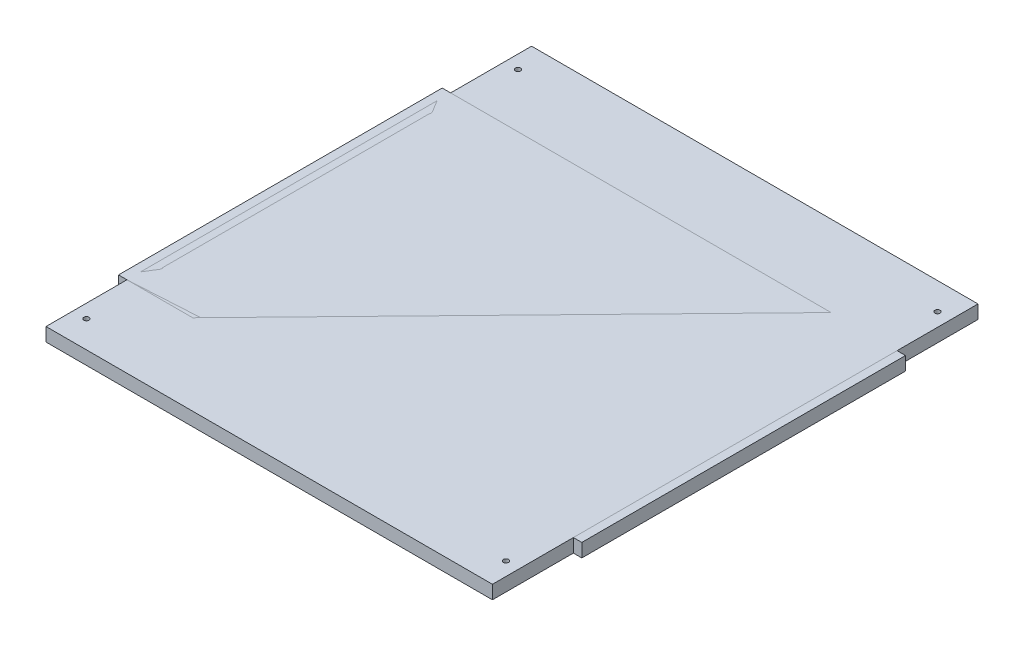
ISO-10303-21;
HEADER;
FILE_DESCRIPTION(('STEP AP214'),'2;1');
FILE_NAME('part.step','',(''),(''),'','','');
FILE_SCHEMA(('AUTOMOTIVE_DESIGN { 1 0 10303 214 1 1 1 1 }'));
ENDSEC;
DATA;
#1=APPLICATION_CONTEXT('core data for automotive mechanical design processes');
#2=APPLICATION_PROTOCOL_DEFINITION('international standard','automotive_design',2000,#1);
#3=PRODUCT_CONTEXT('',#1,'mechanical');
#4=PRODUCT('Part','Part','',(#3));
#5=PRODUCT_RELATED_PRODUCT_CATEGORY('part','',(#4));
#6=PRODUCT_DEFINITION_FORMATION('','',#4);
#7=PRODUCT_DEFINITION_CONTEXT('part definition',#1,'design');
#8=PRODUCT_DEFINITION('design','',#6,#7);
#9=PRODUCT_DEFINITION_SHAPE('','',#8);
#10=(LENGTH_UNIT() NAMED_UNIT(*) SI_UNIT(.MILLI.,.METRE.));
#11=(NAMED_UNIT(*) PLANE_ANGLE_UNIT() SI_UNIT($,.RADIAN.));
#12=(NAMED_UNIT(*) SI_UNIT($,.STERADIAN.) SOLID_ANGLE_UNIT());
#13=UNCERTAINTY_MEASURE_WITH_UNIT(LENGTH_MEASURE(1.E-05),#10,'distance_accuracy_value','');
#14=(GEOMETRIC_REPRESENTATION_CONTEXT(3) GLOBAL_UNCERTAINTY_ASSIGNED_CONTEXT((#13)) GLOBAL_UNIT_ASSIGNED_CONTEXT((#10,
#11,#12)) REPRESENTATION_CONTEXT('',''));
#15=CARTESIAN_POINT('',(0.,0.,0.));
#16=DIRECTION('',(0.,0.,1.));
#17=DIRECTION('',(1.,0.,0.));
#18=AXIS2_PLACEMENT_3D('',#15,#16,#17);
#19=CARTESIAN_POINT('',(210.185,12.7,228.6));
#20=DIRECTION('',(-1.,0.,0.));
#21=DIRECTION('',(0.,0.,1.));
#22=AXIS2_PLACEMENT_3D('',#19,#20,#21);
#23=PLANE('',#22);
#24=DIRECTION('',(0.,0.,-1.));
#25=VECTOR('',#24,1.);
#26=CARTESIAN_POINT('',(210.185,0.,228.6));
#27=LINE('',#26,#25);
#28=CARTESIAN_POINT('',(210.185,0.,228.6));
#29=VERTEX_POINT('',#28);
#30=CARTESIAN_POINT('',(210.185,0.,-228.6));
#31=VERTEX_POINT('',#30);
#32=EDGE_CURVE('E106',#29,#31,#27,.T.);
#33=ORIENTED_EDGE('',*,*,#32,.T.);
#34=DIRECTION('',(0.,-1.,0.));
#35=VECTOR('',#34,1.);
#36=CARTESIAN_POINT('',(210.185,12.7,-228.6));
#37=LINE('',#36,#35);
#38=CARTESIAN_POINT('',(210.185,12.7,-228.6));
#39=VERTEX_POINT('',#38);
#40=EDGE_CURVE('E12',#39,#31,#37,.T.);
#41=ORIENTED_EDGE('',*,*,#40,.F.);
#42=DIRECTION('',(0.,0.,-1.));
#43=VECTOR('',#42,1.);
#44=CARTESIAN_POINT('',(210.185,12.7,228.6));
#45=LINE('',#44,#43);
#46=CARTESIAN_POINT('',(210.185,12.7,228.6));
#47=VERTEX_POINT('',#46);
#48=EDGE_CURVE('E94',#47,#39,#45,.T.);
#49=ORIENTED_EDGE('',*,*,#48,.F.);
#50=DIRECTION('',(0.,-1.,0.));
#51=VECTOR('',#50,1.);
#52=CARTESIAN_POINT('',(210.185,12.7,228.6));
#53=LINE('',#52,#51);
#54=EDGE_CURVE('E102',#47,#29,#53,.T.);
#55=ORIENTED_EDGE('',*,*,#54,.T.);
#56=EDGE_LOOP('',(#33,#41,#49,#55));
#57=FACE_BOUND('',#56,.T.);
#58=ADVANCED_FACE('F43',(#57),#23,.F.);
#59=CARTESIAN_POINT('',(-210.185,12.7,-228.6));
#60=DIRECTION('',(0.,0.,1.));
#61=DIRECTION('',(1.,0.,0.));
#62=AXIS2_PLACEMENT_3D('',#59,#60,#61);
#63=PLANE('',#62);
#64=DIRECTION('',(-1.,0.,0.));
#65=VECTOR('',#64,1.);
#66=CARTESIAN_POINT('',(-210.185,0.,-228.6));
#67=LINE('',#66,#65);
#68=CARTESIAN_POINT('',(-210.185,0.,-228.6));
#69=VERTEX_POINT('',#68);
#70=EDGE_CURVE('E98',#31,#69,#67,.T.);
#71=ORIENTED_EDGE('',*,*,#70,.T.);
#72=DIRECTION('',(0.,-1.,0.));
#73=VECTOR('',#72,1.);
#74=CARTESIAN_POINT('',(-210.185,12.7,-228.6));
#75=LINE('',#74,#73);
#76=CARTESIAN_POINT('',(-210.185,12.7,-228.6));
#77=VERTEX_POINT('',#76);
#78=EDGE_CURVE('E51',#77,#69,#75,.T.);
#79=ORIENTED_EDGE('',*,*,#78,.F.);
#80=DIRECTION('',(-1.,0.,0.));
#81=VECTOR('',#80,1.);
#82=CARTESIAN_POINT('',(-210.185,12.7,-228.6));
#83=LINE('',#82,#81);
#84=EDGE_CURVE('E89',#39,#77,#83,.T.);
#85=ORIENTED_EDGE('',*,*,#84,.F.);
#86=ORIENTED_EDGE('',*,*,#40,.T.);
#87=EDGE_LOOP('',(#71,#79,#85,#86));
#88=FACE_BOUND('',#87,.T.);
#89=ADVANCED_FACE('F97',(#88),#63,.F.);
#90=CARTESIAN_POINT('',(-210.185,12.7,228.6));
#91=DIRECTION('',(1.,0.,0.));
#92=DIRECTION('',(0.,0.,-1.));
#93=AXIS2_PLACEMENT_3D('',#90,#91,#92);
#94=PLANE('',#93);
#95=DIRECTION('',(0.,0.,1.));
#96=VECTOR('',#95,1.);
#97=CARTESIAN_POINT('',(-210.185,0.,228.6));
#98=LINE('',#97,#96);
#99=CARTESIAN_POINT('',(-210.185,0.,228.6));
#100=VERTEX_POINT('',#99);
#101=EDGE_CURVE('E76',#69,#100,#98,.T.);
#102=ORIENTED_EDGE('',*,*,#101,.T.);
#103=DIRECTION('',(0.,-1.,0.));
#104=VECTOR('',#103,1.);
#105=CARTESIAN_POINT('',(-210.185,12.7,228.6));
#106=LINE('',#105,#104);
#107=CARTESIAN_POINT('',(-210.185,12.7,228.6));
#108=VERTEX_POINT('',#107);
#109=EDGE_CURVE('E99',#108,#100,#106,.T.);
#110=ORIENTED_EDGE('',*,*,#109,.F.);
#111=DIRECTION('',(0.,0.,1.));
#112=VECTOR('',#111,1.);
#113=CARTESIAN_POINT('',(-210.185,12.7,228.6));
#114=LINE('',#113,#112);
#115=EDGE_CURVE('E92',#77,#108,#114,.T.);
#116=ORIENTED_EDGE('',*,*,#115,.F.);
#117=ORIENTED_EDGE('',*,*,#78,.T.);
#118=EDGE_LOOP('',(#102,#110,#116,#117));
#119=FACE_BOUND('',#118,.T.);
#120=ADVANCED_FACE('F100',(#119),#94,.F.);
#121=CARTESIAN_POINT('',(-210.185,12.7,228.6));
#122=DIRECTION('',(0.,0.,-1.));
#123=DIRECTION('',(-1.,0.,0.));
#124=AXIS2_PLACEMENT_3D('',#121,#122,#123);
#125=PLANE('',#124);
#126=DIRECTION('',(1.,0.,0.));
#127=VECTOR('',#126,1.);
#128=CARTESIAN_POINT('',(-210.185,0.,228.6));
#129=LINE('',#128,#127);
#130=EDGE_CURVE('E82',#100,#29,#129,.T.);
#131=ORIENTED_EDGE('',*,*,#130,.T.);
#132=ORIENTED_EDGE('',*,*,#54,.F.);
#133=DIRECTION('',(1.,0.,0.));
#134=VECTOR('',#133,1.);
#135=CARTESIAN_POINT('',(-210.185,12.7,228.6));
#136=LINE('',#135,#134);
#137=EDGE_CURVE('E59',#108,#47,#136,.T.);
#138=ORIENTED_EDGE('',*,*,#137,.F.);
#139=ORIENTED_EDGE('',*,*,#109,.T.);
#140=EDGE_LOOP('',(#131,#132,#138,#139));
#141=FACE_BOUND('',#140,.T.);
#142=ADVANCED_FACE('F114',(#141),#125,.F.);
#143=CARTESIAN_POINT('',(0.,12.7,0.));
#144=DIRECTION('',(0.,-1.,0.));
#145=DIRECTION('',(0.,0.,-1.));
#146=AXIS2_PLACEMENT_3D('',#143,#144,#145);
#147=PLANE('',#146);
#148=CARTESIAN_POINT('',(-197.485,12.7,203.2));
#149=DIRECTION('',(0.,-1.,0.));
#150=DIRECTION('',(0.,0.,-1.));
#151=AXIS2_PLACEMENT_3D('',#148,#149,#150);
#152=CIRCLE('',#151,2.45745);
#153=CARTESIAN_POINT('',(-197.485,12.7,200.74255));
#154=VERTEX_POINT('',#153);
#155=EDGE_CURVE('E137',#154,#154,#152,.T.);
#156=ORIENTED_EDGE('',*,*,#155,.T.);
#157=EDGE_LOOP('',(#156));
#158=FACE_BOUND('',#157,.T.);
#159=CARTESIAN_POINT('',(-197.485,12.7,-203.2));
#160=DIRECTION('',(0.,-1.,0.));
#161=DIRECTION('',(0.,0.,-1.));
#162=AXIS2_PLACEMENT_3D('',#159,#160,#161);
#163=CIRCLE('',#162,2.45745);
#164=CARTESIAN_POINT('',(-197.485,12.7,-205.65745));
#165=VERTEX_POINT('',#164);
#166=EDGE_CURVE('E131',#165,#165,#163,.T.);
#167=ORIENTED_EDGE('',*,*,#166,.T.);
#168=EDGE_LOOP('',(#167));
#169=FACE_BOUND('',#168,.T.);
#170=CARTESIAN_POINT('',(197.485,12.7,-203.2));
#171=DIRECTION('',(0.,-1.,0.));
#172=DIRECTION('',(0.,0.,-1.));
#173=AXIS2_PLACEMENT_3D('',#170,#171,#172);
#174=CIRCLE('',#173,2.45745);
#175=CARTESIAN_POINT('',(197.485,12.7,-205.65745));
#176=VERTEX_POINT('',#175);
#177=EDGE_CURVE('E125',#176,#176,#174,.T.);
#178=ORIENTED_EDGE('',*,*,#177,.T.);
#179=EDGE_LOOP('',(#178));
#180=FACE_BOUND('',#179,.T.);
#181=CARTESIAN_POINT('',(197.485,12.7,203.2));
#182=DIRECTION('',(0.,-1.,0.));
#183=DIRECTION('',(0.,0.,-1.));
#184=AXIS2_PLACEMENT_3D('',#181,#182,#183);
#185=CIRCLE('',#184,2.45745);
#186=CARTESIAN_POINT('',(197.485,12.7,200.74255));
#187=VERTEX_POINT('',#186);
#188=EDGE_CURVE('E109',#187,#187,#185,.T.);
#189=ORIENTED_EDGE('',*,*,#188,.T.);
#190=EDGE_LOOP('',(#189));
#191=FACE_BOUND('',#190,.T.);
#192=ORIENTED_EDGE('',*,*,#48,.T.);
#193=ORIENTED_EDGE('',*,*,#84,.T.);
#194=ORIENTED_EDGE('',*,*,#115,.T.);
#195=ORIENTED_EDGE('',*,*,#137,.T.);
#196=EDGE_LOOP('',(#192,#193,#194,#195));
#197=FACE_BOUND('',#196,.T.);
#198=ADVANCED_FACE('F90',(#158,#169,#180,#191,#197),#147,.F.);
#199=CARTESIAN_POINT('',(0.,0.,0.));
#200=DIRECTION('',(0.,-1.,0.));
#201=DIRECTION('',(0.,0.,-1.));
#202=AXIS2_PLACEMENT_3D('',#199,#200,#201);
#203=PLANE('',#202);
#204=CARTESIAN_POINT('',(-197.485,0.,203.2));
#205=DIRECTION('',(0.,-1.,0.));
#206=DIRECTION('',(0.,0.,-1.));
#207=AXIS2_PLACEMENT_3D('',#204,#205,#206);
#208=CIRCLE('',#207,2.45745);
#209=CARTESIAN_POINT('',(-197.485,0.,200.74255));
#210=VERTEX_POINT('',#209);
#211=EDGE_CURVE('E140',#210,#210,#208,.T.);
#212=ORIENTED_EDGE('',*,*,#211,.F.);
#213=EDGE_LOOP('',(#212));
#214=FACE_BOUND('',#213,.T.);
#215=CARTESIAN_POINT('',(-197.485,0.,-203.2));
#216=DIRECTION('',(0.,-1.,0.));
#217=DIRECTION('',(0.,0.,-1.));
#218=AXIS2_PLACEMENT_3D('',#215,#216,#217);
#219=CIRCLE('',#218,2.45745);
#220=CARTESIAN_POINT('',(-197.485,0.,-205.65745));
#221=VERTEX_POINT('',#220);
#222=EDGE_CURVE('E134',#221,#221,#219,.T.);
#223=ORIENTED_EDGE('',*,*,#222,.F.);
#224=EDGE_LOOP('',(#223));
#225=FACE_BOUND('',#224,.T.);
#226=CARTESIAN_POINT('',(197.485,0.,-203.2));
#227=DIRECTION('',(0.,-1.,0.));
#228=DIRECTION('',(0.,0.,-1.));
#229=AXIS2_PLACEMENT_3D('',#226,#227,#228);
#230=CIRCLE('',#229,2.45745);
#231=CARTESIAN_POINT('',(197.485,0.,-205.65745));
#232=VERTEX_POINT('',#231);
#233=EDGE_CURVE('E128',#232,#232,#230,.T.);
#234=ORIENTED_EDGE('',*,*,#233,.F.);
#235=EDGE_LOOP('',(#234));
#236=FACE_BOUND('',#235,.T.);
#237=CARTESIAN_POINT('',(197.485,0.,203.2));
#238=DIRECTION('',(0.,-1.,0.));
#239=DIRECTION('',(0.,0.,-1.));
#240=AXIS2_PLACEMENT_3D('',#237,#238,#239);
#241=CIRCLE('',#240,2.45745);
#242=CARTESIAN_POINT('',(197.485,0.,200.74255));
#243=VERTEX_POINT('',#242);
#244=EDGE_CURVE('E122',#243,#243,#241,.T.);
#245=ORIENTED_EDGE('',*,*,#244,.F.);
#246=EDGE_LOOP('',(#245));
#247=FACE_BOUND('',#246,.T.);
#248=ORIENTED_EDGE('',*,*,#32,.F.);
#249=ORIENTED_EDGE('',*,*,#130,.F.);
#250=ORIENTED_EDGE('',*,*,#101,.F.);
#251=ORIENTED_EDGE('',*,*,#70,.F.);
#252=EDGE_LOOP('',(#248,#249,#250,#251));
#253=FACE_BOUND('',#252,.T.);
#254=ADVANCED_FACE('F117',(#214,#225,#236,#247,#253),#203,.T.);
#255=CARTESIAN_POINT('',(197.485,0.,203.2));
#256=DIRECTION('',(0.,-1.,0.));
#257=DIRECTION('',(0.,0.,-1.));
#258=AXIS2_PLACEMENT_3D('',#255,#256,#257);
#259=CYLINDRICAL_SURFACE('',#258,2.45745);
#260=ORIENTED_EDGE('',*,*,#188,.F.);
#261=EDGE_LOOP('',(#260));
#262=FACE_BOUND('',#261,.T.);
#263=ORIENTED_EDGE('',*,*,#244,.T.);
#264=EDGE_LOOP('',(#263));
#265=FACE_BOUND('',#264,.T.);
#266=ADVANCED_FACE('F148',(#262,#265),#259,.F.);
#267=CARTESIAN_POINT('',(197.485,0.,-203.2));
#268=DIRECTION('',(0.,-1.,0.));
#269=DIRECTION('',(0.,0.,-1.));
#270=AXIS2_PLACEMENT_3D('',#267,#268,#269);
#271=CYLINDRICAL_SURFACE('',#270,2.45745);
#272=ORIENTED_EDGE('',*,*,#177,.F.);
#273=EDGE_LOOP('',(#272));
#274=FACE_BOUND('',#273,.T.);
#275=ORIENTED_EDGE('',*,*,#233,.T.);
#276=EDGE_LOOP('',(#275));
#277=FACE_BOUND('',#276,.T.);
#278=ADVANCED_FACE('F157',(#274,#277),#271,.F.);
#279=CARTESIAN_POINT('',(-197.485,0.,-203.2));
#280=DIRECTION('',(0.,-1.,0.));
#281=DIRECTION('',(0.,0.,-1.));
#282=AXIS2_PLACEMENT_3D('',#279,#280,#281);
#283=CYLINDRICAL_SURFACE('',#282,2.45745);
#284=ORIENTED_EDGE('',*,*,#166,.F.);
#285=EDGE_LOOP('',(#284));
#286=FACE_BOUND('',#285,.T.);
#287=ORIENTED_EDGE('',*,*,#222,.T.);
#288=EDGE_LOOP('',(#287));
#289=FACE_BOUND('',#288,.T.);
#290=ADVANCED_FACE('F163',(#286,#289),#283,.F.);
#291=CARTESIAN_POINT('',(-197.485,0.,203.2));
#292=DIRECTION('',(0.,-1.,0.));
#293=DIRECTION('',(0.,0.,-1.));
#294=AXIS2_PLACEMENT_3D('',#291,#292,#293);
#295=CYLINDRICAL_SURFACE('',#294,2.45745);
#296=ORIENTED_EDGE('',*,*,#155,.F.);
#297=EDGE_LOOP('',(#296));
#298=FACE_BOUND('',#297,.T.);
#299=ORIENTED_EDGE('',*,*,#211,.T.);
#300=EDGE_LOOP('',(#299));
#301=FACE_BOUND('',#300,.T.);
#302=ADVANCED_FACE('F144',(#298,#301),#295,.F.);
#303=CLOSED_SHELL('',(#58,#89,#120,#142,#198,#254,#266,#278,#290,#302));
#304=MANIFOLD_SOLID_BREP('B2',#303);
#305=CARTESIAN_POINT('',(210.185,12.7,152.4));
#306=DIRECTION('',(-1.,0.,0.));
#307=DIRECTION('',(0.,0.,1.));
#308=AXIS2_PLACEMENT_3D('',#305,#306,#307);
#309=PLANE('',#308);
#310=DIRECTION('',(0.,0.,-1.));
#311=VECTOR('',#310,1.);
#312=CARTESIAN_POINT('',(210.185,0.,152.4));
#313=LINE('',#312,#311);
#314=CARTESIAN_POINT('',(210.185,0.,152.4));
#315=VERTEX_POINT('',#314);
#316=CARTESIAN_POINT('',(210.185,0.,-152.4));
#317=VERTEX_POINT('',#316);
#318=EDGE_CURVE('E323',#315,#317,#313,.T.);
#319=ORIENTED_EDGE('',*,*,#318,.T.);
#320=DIRECTION('',(0.,-1.,0.));
#321=VECTOR('',#320,1.);
#322=CARTESIAN_POINT('',(210.185,12.7,-152.4));
#323=LINE('',#322,#321);
#324=CARTESIAN_POINT('',(210.185,12.7,-152.4));
#325=VERTEX_POINT('',#324);
#326=EDGE_CURVE('E41',#325,#317,#323,.T.);
#327=ORIENTED_EDGE('',*,*,#326,.F.);
#328=DIRECTION('',(0.,0.,-1.));
#329=VECTOR('',#328,1.);
#330=CARTESIAN_POINT('',(210.185,12.7,152.4));
#331=LINE('',#330,#329);
#332=CARTESIAN_POINT('',(210.185,12.7,152.4));
#333=VERTEX_POINT('',#332);
#334=EDGE_CURVE('E311',#333,#325,#331,.T.);
#335=ORIENTED_EDGE('',*,*,#334,.F.);
#336=DIRECTION('',(0.,-1.,0.));
#337=VECTOR('',#336,1.);
#338=CARTESIAN_POINT('',(210.185,12.7,152.4));
#339=LINE('',#338,#337);
#340=EDGE_CURVE('E319',#333,#315,#339,.T.);
#341=ORIENTED_EDGE('',*,*,#340,.T.);
#342=EDGE_LOOP('',(#319,#327,#335,#341));
#343=FACE_BOUND('',#342,.T.);
#344=ADVANCED_FACE('F260',(#343),#309,.F.);
#345=CARTESIAN_POINT('',(-210.185,12.7,-152.4));
#346=DIRECTION('',(0.,0.,1.));
#347=DIRECTION('',(1.,0.,0.));
#348=AXIS2_PLACEMENT_3D('',#345,#346,#347);
#349=PLANE('',#348);
#350=DIRECTION('',(-1.,0.,0.));
#351=VECTOR('',#350,1.);
#352=CARTESIAN_POINT('',(-210.185,0.,-152.4));
#353=LINE('',#352,#351);
#354=CARTESIAN_POINT('',(-210.185,0.,-152.4));
#355=VERTEX_POINT('',#354);
#356=EDGE_CURVE('E315',#317,#355,#353,.T.);
#357=ORIENTED_EDGE('',*,*,#356,.T.);
#358=DIRECTION('',(0.,-1.,0.));
#359=VECTOR('',#358,1.);
#360=CARTESIAN_POINT('',(-210.185,12.7,-152.4));
#361=LINE('',#360,#359);
#362=CARTESIAN_POINT('',(-210.185,12.7,-152.4));
#363=VERTEX_POINT('',#362);
#364=EDGE_CURVE('E268',#363,#355,#361,.T.);
#365=ORIENTED_EDGE('',*,*,#364,.F.);
#366=DIRECTION('',(-1.,0.,0.));
#367=VECTOR('',#366,1.);
#368=CARTESIAN_POINT('',(-210.185,12.7,-152.4));
#369=LINE('',#368,#367);
#370=EDGE_CURVE('E306',#325,#363,#369,.T.);
#371=ORIENTED_EDGE('',*,*,#370,.F.);
#372=ORIENTED_EDGE('',*,*,#326,.T.);
#373=EDGE_LOOP('',(#357,#365,#371,#372));
#374=FACE_BOUND('',#373,.T.);
#375=ADVANCED_FACE('F314',(#374),#349,.F.);
#376=CARTESIAN_POINT('',(-210.185,12.7,152.4));
#377=DIRECTION('',(1.,0.,0.));
#378=DIRECTION('',(0.,0.,-1.));
#379=AXIS2_PLACEMENT_3D('',#376,#377,#378);
#380=PLANE('',#379);
#381=DIRECTION('',(0.,0.,1.));
#382=VECTOR('',#381,1.);
#383=CARTESIAN_POINT('',(-210.185,0.,152.4));
#384=LINE('',#383,#382);
#385=CARTESIAN_POINT('',(-210.185,0.,152.4));
#386=VERTEX_POINT('',#385);
#387=EDGE_CURVE('E293',#355,#386,#384,.T.);
#388=ORIENTED_EDGE('',*,*,#387,.T.);
#389=DIRECTION('',(0.,-1.,0.));
#390=VECTOR('',#389,1.);
#391=CARTESIAN_POINT('',(-210.185,12.7,152.4));
#392=LINE('',#391,#390);
#393=CARTESIAN_POINT('',(-210.185,12.7,152.4));
#394=VERTEX_POINT('',#393);
#395=EDGE_CURVE('E316',#394,#386,#392,.T.);
#396=ORIENTED_EDGE('',*,*,#395,.F.);
#397=DIRECTION('',(0.,0.,1.));
#398=VECTOR('',#397,1.);
#399=CARTESIAN_POINT('',(-210.185,12.7,152.4));
#400=LINE('',#399,#398);
#401=EDGE_CURVE('E309',#363,#394,#400,.T.);
#402=ORIENTED_EDGE('',*,*,#401,.F.);
#403=ORIENTED_EDGE('',*,*,#364,.T.);
#404=EDGE_LOOP('',(#388,#396,#402,#403));
#405=FACE_BOUND('',#404,.T.);
#406=ADVANCED_FACE('F317',(#405),#380,.F.);
#407=CARTESIAN_POINT('',(-210.185,12.7,152.4));
#408=DIRECTION('',(0.,0.,-1.));
#409=DIRECTION('',(-1.,0.,0.));
#410=AXIS2_PLACEMENT_3D('',#407,#408,#409);
#411=PLANE('',#410);
#412=DIRECTION('',(1.,0.,0.));
#413=VECTOR('',#412,1.);
#414=CARTESIAN_POINT('',(-210.185,0.,152.4));
#415=LINE('',#414,#413);
#416=EDGE_CURVE('E299',#386,#315,#415,.T.);
#417=ORIENTED_EDGE('',*,*,#416,.T.);
#418=ORIENTED_EDGE('',*,*,#340,.F.);
#419=DIRECTION('',(1.,0.,0.));
#420=VECTOR('',#419,1.);
#421=CARTESIAN_POINT('',(-210.185,12.7,152.4));
#422=LINE('',#421,#420);
#423=EDGE_CURVE('E276',#394,#333,#422,.T.);
#424=ORIENTED_EDGE('',*,*,#423,.F.);
#425=ORIENTED_EDGE('',*,*,#395,.T.);
#426=EDGE_LOOP('',(#417,#418,#424,#425));
#427=FACE_BOUND('',#426,.T.);
#428=ADVANCED_FACE('F331',(#427),#411,.F.);
#429=CARTESIAN_POINT('',(0.,12.7,0.));
#430=DIRECTION('',(0.,-1.,0.));
#431=DIRECTION('',(0.,0.,-1.));
#432=AXIS2_PLACEMENT_3D('',#429,#430,#431);
#433=PLANE('',#432);
#434=CARTESIAN_POINT('',(-197.485,12.7,127.));
#435=DIRECTION('',(0.,-1.,0.));
#436=DIRECTION('',(0.,0.,-1.));
#437=AXIS2_PLACEMENT_3D('',#434,#435,#436);
#438=CIRCLE('',#437,2.55269999999999);
#439=CARTESIAN_POINT('',(-197.485,12.7,124.4473));
#440=VERTEX_POINT('',#439);
#441=EDGE_CURVE('E363',#440,#440,#438,.T.);
#442=ORIENTED_EDGE('',*,*,#441,.T.);
#443=EDGE_LOOP('',(#442));
#444=FACE_BOUND('',#443,.T.);
#445=CARTESIAN_POINT('',(-197.485,12.7,-127.));
#446=DIRECTION('',(0.,-1.,0.));
#447=DIRECTION('',(0.,0.,-1.));
#448=AXIS2_PLACEMENT_3D('',#445,#446,#447);
#449=CIRCLE('',#448,2.55269999999999);
#450=CARTESIAN_POINT('',(-197.485,12.7,-129.5527));
#451=VERTEX_POINT('',#450);
#452=EDGE_CURVE('E354',#451,#451,#449,.T.);
#453=ORIENTED_EDGE('',*,*,#452,.T.);
#454=EDGE_LOOP('',(#453));
#455=FACE_BOUND('',#454,.T.);
#456=CARTESIAN_POINT('',(197.485,12.7,-127.));
#457=DIRECTION('',(0.,-1.,0.));
#458=DIRECTION('',(0.,0.,-1.));
#459=AXIS2_PLACEMENT_3D('',#456,#457,#458);
#460=CIRCLE('',#459,2.55269999999999);
#461=CARTESIAN_POINT('',(197.485,12.7,-129.5527));
#462=VERTEX_POINT('',#461);
#463=EDGE_CURVE('E345',#462,#462,#460,.T.);
#464=ORIENTED_EDGE('',*,*,#463,.T.);
#465=EDGE_LOOP('',(#464));
#466=FACE_BOUND('',#465,.T.);
#467=CARTESIAN_POINT('',(197.485,12.7,127.));
#468=DIRECTION('',(0.,-1.,0.));
#469=DIRECTION('',(0.,0.,-1.));
#470=AXIS2_PLACEMENT_3D('',#467,#468,#469);
#471=CIRCLE('',#470,2.55269999999999);
#472=CARTESIAN_POINT('',(197.485,12.7,124.4473));
#473=VERTEX_POINT('',#472);
#474=EDGE_CURVE('E326',#473,#473,#471,.T.);
#475=ORIENTED_EDGE('',*,*,#474,.T.);
#476=EDGE_LOOP('',(#475));
#477=FACE_BOUND('',#476,.T.);
#478=ORIENTED_EDGE('',*,*,#334,.T.);
#479=ORIENTED_EDGE('',*,*,#370,.T.);
#480=ORIENTED_EDGE('',*,*,#401,.T.);
#481=ORIENTED_EDGE('',*,*,#423,.T.);
#482=EDGE_LOOP('',(#478,#479,#480,#481));
#483=FACE_BOUND('',#482,.T.);
#484=ADVANCED_FACE('F307',(#444,#455,#466,#477,#483),#433,.F.);
#485=CARTESIAN_POINT('',(0.,0.,0.));
#486=DIRECTION('',(0.,-1.,0.));
#487=DIRECTION('',(0.,0.,-1.));
#488=AXIS2_PLACEMENT_3D('',#485,#486,#487);
#489=PLANE('',#488);
#490=CARTESIAN_POINT('',(-197.485,0.,127.));
#491=DIRECTION('',(0.,-1.,0.));
#492=DIRECTION('',(0.,0.,-1.));
#493=AXIS2_PLACEMENT_3D('',#490,#491,#492);
#494=CIRCLE('',#493,3.17500000000001);
#495=CARTESIAN_POINT('',(-197.485,0.,123.825));
#496=VERTEX_POINT('',#495);
#497=EDGE_CURVE('E369',#496,#496,#494,.T.);
#498=ORIENTED_EDGE('',*,*,#497,.F.);
#499=EDGE_LOOP('',(#498));
#500=FACE_BOUND('',#499,.T.);
#501=CARTESIAN_POINT('',(-197.485,0.,-127.));
#502=DIRECTION('',(0.,-1.,0.));
#503=DIRECTION('',(0.,0.,-1.));
#504=AXIS2_PLACEMENT_3D('',#501,#502,#503);
#505=CIRCLE('',#504,3.17500000000001);
#506=CARTESIAN_POINT('',(-197.485,0.,-130.175));
#507=VERTEX_POINT('',#506);
#508=EDGE_CURVE('E360',#507,#507,#505,.T.);
#509=ORIENTED_EDGE('',*,*,#508,.F.);
#510=EDGE_LOOP('',(#509));
#511=FACE_BOUND('',#510,.T.);
#512=CARTESIAN_POINT('',(197.485,0.,-127.));
#513=DIRECTION('',(0.,-1.,0.));
#514=DIRECTION('',(0.,0.,-1.));
#515=AXIS2_PLACEMENT_3D('',#512,#513,#514);
#516=CIRCLE('',#515,3.17500000000001);
#517=CARTESIAN_POINT('',(197.485,0.,-130.175));
#518=VERTEX_POINT('',#517);
#519=EDGE_CURVE('E351',#518,#518,#516,.T.);
#520=ORIENTED_EDGE('',*,*,#519,.F.);
#521=EDGE_LOOP('',(#520));
#522=FACE_BOUND('',#521,.T.);
#523=CARTESIAN_POINT('',(197.485,0.,127.));
#524=DIRECTION('',(0.,-1.,0.));
#525=DIRECTION('',(0.,0.,-1.));
#526=AXIS2_PLACEMENT_3D('',#523,#524,#525);
#527=CIRCLE('',#526,3.17500000000001);
#528=CARTESIAN_POINT('',(197.485,0.,123.825));
#529=VERTEX_POINT('',#528);
#530=EDGE_CURVE('E342',#529,#529,#527,.T.);
#531=ORIENTED_EDGE('',*,*,#530,.F.);
#532=EDGE_LOOP('',(#531));
#533=FACE_BOUND('',#532,.T.);
#534=ORIENTED_EDGE('',*,*,#318,.F.);
#535=ORIENTED_EDGE('',*,*,#416,.F.);
#536=ORIENTED_EDGE('',*,*,#387,.F.);
#537=ORIENTED_EDGE('',*,*,#356,.F.);
#538=EDGE_LOOP('',(#534,#535,#536,#537));
#539=FACE_BOUND('',#538,.T.);
#540=ADVANCED_FACE('F334',(#500,#511,#522,#533,#539),#489,.T.);
#541=CARTESIAN_POINT('',(197.485,0.,127.));
#542=DIRECTION('',(0.,-1.,0.));
#543=DIRECTION('',(0.,0.,-1.));
#544=AXIS2_PLACEMENT_3D('',#541,#542,#543);
#545=CYLINDRICAL_SURFACE('',#544,2.55269999999999);
#546=ORIENTED_EDGE('',*,*,#474,.F.);
#547=EDGE_LOOP('',(#546));
#548=FACE_BOUND('',#547,.T.);
#549=CARTESIAN_POINT('',(197.485,0.715874259813632,127.));
#550=DIRECTION('',(0.,-1.,0.));
#551=DIRECTION('',(0.,0.,-1.));
#552=AXIS2_PLACEMENT_3D('',#549,#550,#551);
#553=CIRCLE('',#552,2.55269999999999);
#554=CARTESIAN_POINT('',(197.485,0.715874259813632,124.4473));
#555=VERTEX_POINT('',#554);
#556=EDGE_CURVE('E339',#555,#555,#553,.T.);
#557=ORIENTED_EDGE('',*,*,#556,.T.);
#558=EDGE_LOOP('',(#557));
#559=FACE_BOUND('',#558,.T.);
#560=ADVANCED_FACE('F377',(#548,#559),#545,.F.);
#561=CARTESIAN_POINT('',(197.485,0.,127.));
#562=DIRECTION('',(0.,-1.,0.));
#563=DIRECTION('',(0.,0.,-1.));
#564=AXIS2_PLACEMENT_3D('',#561,#562,#563);
#565=CONICAL_SURFACE('',#564,3.17500000000001,0.715584993317692);
#566=ORIENTED_EDGE('',*,*,#556,.F.);
#567=EDGE_LOOP('',(#566));
#568=FACE_BOUND('',#567,.T.);
#569=ORIENTED_EDGE('',*,*,#530,.T.);
#570=EDGE_LOOP('',(#569));
#571=FACE_BOUND('',#570,.T.);
#572=ADVANCED_FACE('F385',(#568,#571),#565,.F.);
#573=CARTESIAN_POINT('',(197.485,0.,-127.));
#574=DIRECTION('',(0.,-1.,0.));
#575=DIRECTION('',(0.,0.,-1.));
#576=AXIS2_PLACEMENT_3D('',#573,#574,#575);
#577=CYLINDRICAL_SURFACE('',#576,2.55269999999999);
#578=ORIENTED_EDGE('',*,*,#463,.F.);
#579=EDGE_LOOP('',(#578));
#580=FACE_BOUND('',#579,.T.);
#581=CARTESIAN_POINT('',(197.485,0.715874259813632,-127.));
#582=DIRECTION('',(0.,-1.,0.));
#583=DIRECTION('',(0.,0.,-1.));
#584=AXIS2_PLACEMENT_3D('',#581,#582,#583);
#585=CIRCLE('',#584,2.55269999999999);
#586=CARTESIAN_POINT('',(197.485,0.715874259813632,-129.5527));
#587=VERTEX_POINT('',#586);
#588=EDGE_CURVE('E348',#587,#587,#585,.T.);
#589=ORIENTED_EDGE('',*,*,#588,.T.);
#590=EDGE_LOOP('',(#589));
#591=FACE_BOUND('',#590,.T.);
#592=ADVANCED_FACE('F387',(#580,#591),#577,.F.);
#593=CARTESIAN_POINT('',(197.485,0.,-127.));
#594=DIRECTION('',(0.,-1.,0.));
#595=DIRECTION('',(0.,0.,-1.));
#596=AXIS2_PLACEMENT_3D('',#593,#594,#595);
#597=CONICAL_SURFACE('',#596,3.17500000000001,0.715584993317692);
#598=ORIENTED_EDGE('',*,*,#588,.F.);
#599=EDGE_LOOP('',(#598));
#600=FACE_BOUND('',#599,.T.);
#601=ORIENTED_EDGE('',*,*,#519,.T.);
#602=EDGE_LOOP('',(#601));
#603=FACE_BOUND('',#602,.T.);
#604=ADVANCED_FACE('F394',(#600,#603),#597,.F.);
#605=CARTESIAN_POINT('',(-197.485,0.,-127.));
#606=DIRECTION('',(0.,-1.,0.));
#607=DIRECTION('',(0.,0.,-1.));
#608=AXIS2_PLACEMENT_3D('',#605,#606,#607);
#609=CYLINDRICAL_SURFACE('',#608,2.55269999999999);
#610=ORIENTED_EDGE('',*,*,#452,.F.);
#611=EDGE_LOOP('',(#610));
#612=FACE_BOUND('',#611,.T.);
#613=CARTESIAN_POINT('',(-197.485,0.715874259813632,-127.));
#614=DIRECTION('',(0.,-1.,0.));
#615=DIRECTION('',(0.,0.,-1.));
#616=AXIS2_PLACEMENT_3D('',#613,#614,#615);
#617=CIRCLE('',#616,2.55269999999999);
#618=CARTESIAN_POINT('',(-197.485,0.715874259813632,-129.5527));
#619=VERTEX_POINT('',#618);
#620=EDGE_CURVE('E357',#619,#619,#617,.T.);
#621=ORIENTED_EDGE('',*,*,#620,.T.);
#622=EDGE_LOOP('',(#621));
#623=FACE_BOUND('',#622,.T.);
#624=ADVANCED_FACE('F428',(#612,#623),#609,.F.);
#625=CARTESIAN_POINT('',(-197.485,0.,-127.));
#626=DIRECTION('',(0.,-1.,0.));
#627=DIRECTION('',(0.,0.,-1.));
#628=AXIS2_PLACEMENT_3D('',#625,#626,#627);
#629=CONICAL_SURFACE('',#628,3.17500000000001,0.715584993317692);
#630=ORIENTED_EDGE('',*,*,#620,.F.);
#631=EDGE_LOOP('',(#630));
#632=FACE_BOUND('',#631,.T.);
#633=ORIENTED_EDGE('',*,*,#508,.T.);
#634=EDGE_LOOP('',(#633));
#635=FACE_BOUND('',#634,.T.);
#636=ADVANCED_FACE('F433',(#632,#635),#629,.F.);
#637=CARTESIAN_POINT('',(-197.485,0.,127.));
#638=DIRECTION('',(0.,-1.,0.));
#639=DIRECTION('',(0.,0.,-1.));
#640=AXIS2_PLACEMENT_3D('',#637,#638,#639);
#641=CYLINDRICAL_SURFACE('',#640,2.55269999999999);
#642=ORIENTED_EDGE('',*,*,#441,.F.);
#643=EDGE_LOOP('',(#642));
#644=FACE_BOUND('',#643,.T.);
#645=CARTESIAN_POINT('',(-197.485,0.715874259813632,127.));
#646=DIRECTION('',(0.,-1.,0.));
#647=DIRECTION('',(0.,0.,-1.));
#648=AXIS2_PLACEMENT_3D('',#645,#646,#647);
#649=CIRCLE('',#648,2.55269999999999);
#650=CARTESIAN_POINT('',(-197.485,0.715874259813632,124.4473));
#651=VERTEX_POINT('',#650);
#652=EDGE_CURVE('E366',#651,#651,#649,.T.);
#653=ORIENTED_EDGE('',*,*,#652,.T.);
#654=EDGE_LOOP('',(#653));
#655=FACE_BOUND('',#654,.T.);
#656=ADVANCED_FACE('F439',(#644,#655),#641,.F.);
#657=CARTESIAN_POINT('',(-197.485,0.,127.));
#658=DIRECTION('',(0.,-1.,0.));
#659=DIRECTION('',(0.,0.,-1.));
#660=AXIS2_PLACEMENT_3D('',#657,#658,#659);
#661=CONICAL_SURFACE('',#660,3.17500000000001,0.715584993317692);
#662=ORIENTED_EDGE('',*,*,#652,.F.);
#663=EDGE_LOOP('',(#662));
#664=FACE_BOUND('',#663,.T.);
#665=ORIENTED_EDGE('',*,*,#497,.T.);
#666=EDGE_LOOP('',(#665));
#667=FACE_BOUND('',#666,.T.);
#668=ADVANCED_FACE('F373',(#664,#667),#661,.F.);
#669=CLOSED_SHELL('',(#344,#375,#406,#428,#484,#540,#560,#572,#592,#604,#624,#636,#656,#668));
#670=MANIFOLD_SOLID_BREP('B6',#669);
#671=CARTESIAN_POINT('',(218.1225,12.7,152.4));
#672=DIRECTION('',(-1.,0.,0.));
#673=DIRECTION('',(0.,0.,1.));
#674=AXIS2_PLACEMENT_3D('',#671,#672,#673);
#675=PLANE('',#674);
#676=DIRECTION('',(0.,0.,-1.));
#677=VECTOR('',#676,1.);
#678=CARTESIAN_POINT('',(218.1225,0.,152.4));
#679=LINE('',#678,#677);
#680=CARTESIAN_POINT('',(218.1225,0.,152.4));
#681=VERTEX_POINT('',#680);
#682=CARTESIAN_POINT('',(218.1225,0.,-152.4));
#683=VERTEX_POINT('',#682);
#684=EDGE_CURVE('E590',#681,#683,#679,.T.);
#685=ORIENTED_EDGE('',*,*,#684,.T.);
#686=DIRECTION('',(0.,-1.,0.));
#687=VECTOR('',#686,1.);
#688=CARTESIAN_POINT('',(218.1225,12.7,-152.4));
#689=LINE('',#688,#687);
#690=CARTESIAN_POINT('',(218.1225,12.7,-152.4));
#691=VERTEX_POINT('',#690);
#692=EDGE_CURVE('E258',#691,#683,#689,.T.);
#693=ORIENTED_EDGE('',*,*,#692,.F.);
#694=DIRECTION('',(0.,0.,-1.));
#695=VECTOR('',#694,1.);
#696=CARTESIAN_POINT('',(218.1225,12.7,152.4));
#697=LINE('',#696,#695);
#698=CARTESIAN_POINT('',(218.1225,12.7,152.4));
#699=VERTEX_POINT('',#698);
#700=EDGE_CURVE('E578',#699,#691,#697,.T.);
#701=ORIENTED_EDGE('',*,*,#700,.F.);
#702=DIRECTION('',(0.,-1.,0.));
#703=VECTOR('',#702,1.);
#704=CARTESIAN_POINT('',(218.1225,12.7,152.4));
#705=LINE('',#704,#703);
#706=EDGE_CURVE('E586',#699,#681,#705,.T.);
#707=ORIENTED_EDGE('',*,*,#706,.T.);
#708=EDGE_LOOP('',(#685,#693,#701,#707));
#709=FACE_BOUND('',#708,.T.);
#710=ADVANCED_FACE('F527',(#709),#675,.F.);
#711=CARTESIAN_POINT('',(-218.1225,12.7,-152.4));
#712=DIRECTION('',(0.,0.,1.));
#713=DIRECTION('',(1.,0.,0.));
#714=AXIS2_PLACEMENT_3D('',#711,#712,#713);
#715=PLANE('',#714);
#716=DIRECTION('',(-1.,0.,0.));
#717=VECTOR('',#716,1.);
#718=CARTESIAN_POINT('',(-218.1225,0.,-152.4));
#719=LINE('',#718,#717);
#720=CARTESIAN_POINT('',(-218.1225,0.,-152.4));
#721=VERTEX_POINT('',#720);
#722=EDGE_CURVE('E582',#683,#721,#719,.T.);
#723=ORIENTED_EDGE('',*,*,#722,.T.);
#724=DIRECTION('',(0.,-1.,0.));
#725=VECTOR('',#724,1.);
#726=CARTESIAN_POINT('',(-218.1225,12.7,-152.4));
#727=LINE('',#726,#725);
#728=CARTESIAN_POINT('',(-218.1225,12.7,-152.4));
#729=VERTEX_POINT('',#728);
#730=EDGE_CURVE('E535',#729,#721,#727,.T.);
#731=ORIENTED_EDGE('',*,*,#730,.F.);
#732=DIRECTION('',(-1.,0.,0.));
#733=VECTOR('',#732,1.);
#734=CARTESIAN_POINT('',(-218.1225,12.7,-152.4));
#735=LINE('',#734,#733);
#736=EDGE_CURVE('E573',#691,#729,#735,.T.);
#737=ORIENTED_EDGE('',*,*,#736,.F.);
#738=ORIENTED_EDGE('',*,*,#692,.T.);
#739=EDGE_LOOP('',(#723,#731,#737,#738));
#740=FACE_BOUND('',#739,.T.);
#741=ADVANCED_FACE('F581',(#740),#715,.F.);
#742=CARTESIAN_POINT('',(-218.1225,12.7,152.4));
#743=DIRECTION('',(1.,0.,0.));
#744=DIRECTION('',(0.,0.,-1.));
#745=AXIS2_PLACEMENT_3D('',#742,#743,#744);
#746=PLANE('',#745);
#747=DIRECTION('',(0.,0.,1.));
#748=VECTOR('',#747,1.);
#749=CARTESIAN_POINT('',(-218.1225,0.,152.4));
#750=LINE('',#749,#748);
#751=CARTESIAN_POINT('',(-218.1225,0.,152.4));
#752=VERTEX_POINT('',#751);
#753=EDGE_CURVE('E560',#721,#752,#750,.T.);
#754=ORIENTED_EDGE('',*,*,#753,.T.);
#755=DIRECTION('',(0.,-1.,0.));
#756=VECTOR('',#755,1.);
#757=CARTESIAN_POINT('',(-218.1225,12.7,152.4));
#758=LINE('',#757,#756);
#759=CARTESIAN_POINT('',(-218.1225,12.7,152.4));
#760=VERTEX_POINT('',#759);
#761=EDGE_CURVE('E583',#760,#752,#758,.T.);
#762=ORIENTED_EDGE('',*,*,#761,.F.);
#763=DIRECTION('',(0.,0.,1.));
#764=VECTOR('',#763,1.);
#765=CARTESIAN_POINT('',(-218.1225,12.7,152.4));
#766=LINE('',#765,#764);
#767=EDGE_CURVE('E576',#729,#760,#766,.T.);
#768=ORIENTED_EDGE('',*,*,#767,.F.);
#769=ORIENTED_EDGE('',*,*,#730,.T.);
#770=EDGE_LOOP('',(#754,#762,#768,#769));
#771=FACE_BOUND('',#770,.T.);
#772=ADVANCED_FACE('F584',(#771),#746,.F.);
#773=CARTESIAN_POINT('',(-218.1225,12.7,152.4));
#774=DIRECTION('',(0.,0.,-1.));
#775=DIRECTION('',(-1.,0.,0.));
#776=AXIS2_PLACEMENT_3D('',#773,#774,#775);
#777=PLANE('',#776);
#778=DIRECTION('',(1.,0.,0.));
#779=VECTOR('',#778,1.);
#780=CARTESIAN_POINT('',(-218.1225,0.,152.4));
#781=LINE('',#780,#779);
#782=EDGE_CURVE('E566',#752,#681,#781,.T.);
#783=ORIENTED_EDGE('',*,*,#782,.T.);
#784=ORIENTED_EDGE('',*,*,#706,.F.);
#785=DIRECTION('',(1.,0.,0.));
#786=VECTOR('',#785,1.);
#787=CARTESIAN_POINT('',(-218.1225,12.7,152.4));
#788=LINE('',#787,#786);
#789=EDGE_CURVE('E543',#760,#699,#788,.T.);
#790=ORIENTED_EDGE('',*,*,#789,.F.);
#791=ORIENTED_EDGE('',*,*,#761,.T.);
#792=EDGE_LOOP('',(#783,#784,#790,#791));
#793=FACE_BOUND('',#792,.T.);
#794=ADVANCED_FACE('F598',(#793),#777,.F.);
#795=CARTESIAN_POINT('',(0.,12.7,0.));
#796=DIRECTION('',(0.,-1.,0.));
#797=DIRECTION('',(0.,0.,-1.));
#798=AXIS2_PLACEMENT_3D('',#795,#796,#797);
#799=PLANE('',#798);
#800=CARTESIAN_POINT('',(-205.4225,12.7,127.));
#801=DIRECTION('',(0.,-1.,0.));
#802=DIRECTION('',(0.,0.,-1.));
#803=AXIS2_PLACEMENT_3D('',#800,#801,#802);
#804=CIRCLE('',#803,2.55269999999999);
#805=CARTESIAN_POINT('',(-205.4225,12.7,124.4473));
#806=VERTEX_POINT('',#805);
#807=EDGE_CURVE('E630',#806,#806,#804,.T.);
#808=ORIENTED_EDGE('',*,*,#807,.T.);
#809=EDGE_LOOP('',(#808));
#810=FACE_BOUND('',#809,.T.);
#811=CARTESIAN_POINT('',(-205.4225,12.7,-127.));
#812=DIRECTION('',(0.,-1.,0.));
#813=DIRECTION('',(0.,0.,-1.));
#814=AXIS2_PLACEMENT_3D('',#811,#812,#813);
#815=CIRCLE('',#814,2.55269999999999);
#816=CARTESIAN_POINT('',(-205.4225,12.7,-129.5527));
#817=VERTEX_POINT('',#816);
#818=EDGE_CURVE('E621',#817,#817,#815,.T.);
#819=ORIENTED_EDGE('',*,*,#818,.T.);
#820=EDGE_LOOP('',(#819));
#821=FACE_BOUND('',#820,.T.);
#822=CARTESIAN_POINT('',(205.4225,12.7,-127.));
#823=DIRECTION('',(0.,-1.,0.));
#824=DIRECTION('',(0.,0.,-1.));
#825=AXIS2_PLACEMENT_3D('',#822,#823,#824);
#826=CIRCLE('',#825,2.55269999999999);
#827=CARTESIAN_POINT('',(205.4225,12.7,-129.5527));
#828=VERTEX_POINT('',#827);
#829=EDGE_CURVE('E612',#828,#828,#826,.T.);
#830=ORIENTED_EDGE('',*,*,#829,.T.);
#831=EDGE_LOOP('',(#830));
#832=FACE_BOUND('',#831,.T.);
#833=CARTESIAN_POINT('',(205.4225,12.7,127.));
#834=DIRECTION('',(0.,-1.,0.));
#835=DIRECTION('',(0.,0.,-1.));
#836=AXIS2_PLACEMENT_3D('',#833,#834,#835);
#837=CIRCLE('',#836,2.55269999999999);
#838=CARTESIAN_POINT('',(205.4225,12.7,124.4473));
#839=VERTEX_POINT('',#838);
#840=EDGE_CURVE('E593',#839,#839,#837,.T.);
#841=ORIENTED_EDGE('',*,*,#840,.T.);
#842=EDGE_LOOP('',(#841));
#843=FACE_BOUND('',#842,.T.);
#844=ORIENTED_EDGE('',*,*,#700,.T.);
#845=ORIENTED_EDGE('',*,*,#736,.T.);
#846=ORIENTED_EDGE('',*,*,#767,.T.);
#847=ORIENTED_EDGE('',*,*,#789,.T.);
#848=EDGE_LOOP('',(#844,#845,#846,#847));
#849=FACE_BOUND('',#848,.T.);
#850=ADVANCED_FACE('F574',(#810,#821,#832,#843,#849),#799,.F.);
#851=CARTESIAN_POINT('',(0.,0.,0.));
#852=DIRECTION('',(0.,-1.,0.));
#853=DIRECTION('',(0.,0.,-1.));
#854=AXIS2_PLACEMENT_3D('',#851,#852,#853);
#855=PLANE('',#854);
#856=CARTESIAN_POINT('',(-205.4225,0.,127.));
#857=DIRECTION('',(0.,-1.,0.));
#858=DIRECTION('',(0.,0.,-1.));
#859=AXIS2_PLACEMENT_3D('',#856,#857,#858);
#860=CIRCLE('',#859,3.96874999999999);
#861=CARTESIAN_POINT('',(-205.4225,0.,123.03125));
#862=VERTEX_POINT('',#861);
#863=EDGE_CURVE('E636',#862,#862,#860,.T.);
#864=ORIENTED_EDGE('',*,*,#863,.F.);
#865=EDGE_LOOP('',(#864));
#866=FACE_BOUND('',#865,.T.);
#867=CARTESIAN_POINT('',(-205.4225,0.,-127.));
#868=DIRECTION('',(0.,-1.,0.));
#869=DIRECTION('',(0.,0.,-1.));
#870=AXIS2_PLACEMENT_3D('',#867,#868,#869);
#871=CIRCLE('',#870,3.96874999999999);
#872=CARTESIAN_POINT('',(-205.4225,0.,-130.96875));
#873=VERTEX_POINT('',#872);
#874=EDGE_CURVE('E627',#873,#873,#871,.T.);
#875=ORIENTED_EDGE('',*,*,#874,.F.);
#876=EDGE_LOOP('',(#875));
#877=FACE_BOUND('',#876,.T.);
#878=CARTESIAN_POINT('',(205.4225,0.,-127.));
#879=DIRECTION('',(0.,-1.,0.));
#880=DIRECTION('',(0.,0.,-1.));
#881=AXIS2_PLACEMENT_3D('',#878,#879,#880);
#882=CIRCLE('',#881,3.96874999999999);
#883=CARTESIAN_POINT('',(205.4225,0.,-130.96875));
#884=VERTEX_POINT('',#883);
#885=EDGE_CURVE('E618',#884,#884,#882,.T.);
#886=ORIENTED_EDGE('',*,*,#885,.F.);
#887=EDGE_LOOP('',(#886));
#888=FACE_BOUND('',#887,.T.);
#889=CARTESIAN_POINT('',(205.4225,0.,127.));
#890=DIRECTION('',(0.,-1.,0.));
#891=DIRECTION('',(0.,0.,-1.));
#892=AXIS2_PLACEMENT_3D('',#889,#890,#891);
#893=CIRCLE('',#892,3.96874999999999);
#894=CARTESIAN_POINT('',(205.4225,0.,123.03125));
#895=VERTEX_POINT('',#894);
#896=EDGE_CURVE('E609',#895,#895,#893,.T.);
#897=ORIENTED_EDGE('',*,*,#896,.F.);
#898=EDGE_LOOP('',(#897));
#899=FACE_BOUND('',#898,.T.);
#900=ORIENTED_EDGE('',*,*,#684,.F.);
#901=ORIENTED_EDGE('',*,*,#782,.F.);
#902=ORIENTED_EDGE('',*,*,#753,.F.);
#903=ORIENTED_EDGE('',*,*,#722,.F.);
#904=EDGE_LOOP('',(#900,#901,#902,#903));
#905=FACE_BOUND('',#904,.T.);
#906=ADVANCED_FACE('F601',(#866,#877,#888,#899,#905),#855,.T.);
#907=CARTESIAN_POINT('',(205.4225,0.,127.));
#908=DIRECTION('',(0.,-1.,0.));
#909=DIRECTION('',(0.,0.,-1.));
#910=AXIS2_PLACEMENT_3D('',#907,#908,#909);
#911=CYLINDRICAL_SURFACE('',#910,2.55269999999999);
#912=ORIENTED_EDGE('',*,*,#840,.F.);
#913=EDGE_LOOP('',(#912));
#914=FACE_BOUND('',#913,.T.);
#915=CARTESIAN_POINT('',(205.4225,1.62897918304531,127.));
#916=DIRECTION('',(0.,-1.,0.));
#917=DIRECTION('',(0.,0.,-1.));
#918=AXIS2_PLACEMENT_3D('',#915,#916,#917);
#919=CIRCLE('',#918,2.55269999999999);
#920=CARTESIAN_POINT('',(205.4225,1.62897918304531,124.4473));
#921=VERTEX_POINT('',#920);
#922=EDGE_CURVE('E606',#921,#921,#919,.T.);
#923=ORIENTED_EDGE('',*,*,#922,.T.);
#924=EDGE_LOOP('',(#923));
#925=FACE_BOUND('',#924,.T.);
#926=ADVANCED_FACE('F644',(#914,#925),#911,.F.);
#927=CARTESIAN_POINT('',(205.4225,0.,127.));
#928=DIRECTION('',(0.,-1.,0.));
#929=DIRECTION('',(0.,0.,-1.));
#930=AXIS2_PLACEMENT_3D('',#927,#928,#929);
#931=CONICAL_SURFACE('',#930,3.96874999999999,0.715584993317676);
#932=ORIENTED_EDGE('',*,*,#922,.F.);
#933=EDGE_LOOP('',(#932));
#934=FACE_BOUND('',#933,.T.);
#935=ORIENTED_EDGE('',*,*,#896,.T.);
#936=EDGE_LOOP('',(#935));
#937=FACE_BOUND('',#936,.T.);
#938=ADVANCED_FACE('F652',(#934,#937),#931,.F.);
#939=CARTESIAN_POINT('',(205.4225,0.,-127.));
#940=DIRECTION('',(0.,-1.,0.));
#941=DIRECTION('',(0.,0.,-1.));
#942=AXIS2_PLACEMENT_3D('',#939,#940,#941);
#943=CYLINDRICAL_SURFACE('',#942,2.55269999999999);
#944=ORIENTED_EDGE('',*,*,#829,.F.);
#945=EDGE_LOOP('',(#944));
#946=FACE_BOUND('',#945,.T.);
#947=CARTESIAN_POINT('',(205.4225,1.62897918304531,-127.));
#948=DIRECTION('',(0.,-1.,0.));
#949=DIRECTION('',(0.,0.,-1.));
#950=AXIS2_PLACEMENT_3D('',#947,#948,#949);
#951=CIRCLE('',#950,2.55269999999999);
#952=CARTESIAN_POINT('',(205.4225,1.62897918304531,-129.5527));
#953=VERTEX_POINT('',#952);
#954=EDGE_CURVE('E615',#953,#953,#951,.T.);
#955=ORIENTED_EDGE('',*,*,#954,.T.);
#956=EDGE_LOOP('',(#955));
#957=FACE_BOUND('',#956,.T.);
#958=ADVANCED_FACE('F654',(#946,#957),#943,.F.);
#959=CARTESIAN_POINT('',(205.4225,0.,-127.));
#960=DIRECTION('',(0.,-1.,0.));
#961=DIRECTION('',(0.,0.,-1.));
#962=AXIS2_PLACEMENT_3D('',#959,#960,#961);
#963=CONICAL_SURFACE('',#962,3.96874999999999,0.715584993317676);
#964=ORIENTED_EDGE('',*,*,#954,.F.);
#965=EDGE_LOOP('',(#964));
#966=FACE_BOUND('',#965,.T.);
#967=ORIENTED_EDGE('',*,*,#885,.T.);
#968=EDGE_LOOP('',(#967));
#969=FACE_BOUND('',#968,.T.);
#970=ADVANCED_FACE('F661',(#966,#969),#963,.F.);
#971=CARTESIAN_POINT('',(-205.4225,0.,-127.));
#972=DIRECTION('',(0.,-1.,0.));
#973=DIRECTION('',(0.,0.,-1.));
#974=AXIS2_PLACEMENT_3D('',#971,#972,#973);
#975=CYLINDRICAL_SURFACE('',#974,2.55269999999999);
#976=ORIENTED_EDGE('',*,*,#818,.F.);
#977=EDGE_LOOP('',(#976));
#978=FACE_BOUND('',#977,.T.);
#979=CARTESIAN_POINT('',(-205.4225,1.62897918304531,-127.));
#980=DIRECTION('',(0.,-1.,0.));
#981=DIRECTION('',(0.,0.,-1.));
#982=AXIS2_PLACEMENT_3D('',#979,#980,#981);
#983=CIRCLE('',#982,2.55269999999999);
#984=CARTESIAN_POINT('',(-205.4225,1.62897918304531,-129.5527));
#985=VERTEX_POINT('',#984);
#986=EDGE_CURVE('E624',#985,#985,#983,.T.);
#987=ORIENTED_EDGE('',*,*,#986,.T.);
#988=EDGE_LOOP('',(#987));
#989=FACE_BOUND('',#988,.T.);
#990=ADVANCED_FACE('F695',(#978,#989),#975,.F.);
#991=CARTESIAN_POINT('',(-205.4225,0.,-127.));
#992=DIRECTION('',(0.,-1.,0.));
#993=DIRECTION('',(0.,0.,-1.));
#994=AXIS2_PLACEMENT_3D('',#991,#992,#993);
#995=CONICAL_SURFACE('',#994,3.96874999999999,0.715584993317676);
#996=ORIENTED_EDGE('',*,*,#986,.F.);
#997=EDGE_LOOP('',(#996));
#998=FACE_BOUND('',#997,.T.);
#999=ORIENTED_EDGE('',*,*,#874,.T.);
#1000=EDGE_LOOP('',(#999));
#1001=FACE_BOUND('',#1000,.T.);
#1002=ADVANCED_FACE('F700',(#998,#1001),#995,.F.);
#1003=CARTESIAN_POINT('',(-205.4225,0.,127.));
#1004=DIRECTION('',(0.,-1.,0.));
#1005=DIRECTION('',(0.,0.,-1.));
#1006=AXIS2_PLACEMENT_3D('',#1003,#1004,#1005);
#1007=CYLINDRICAL_SURFACE('',#1006,2.55269999999999);
#1008=ORIENTED_EDGE('',*,*,#807,.F.);
#1009=EDGE_LOOP('',(#1008));
#1010=FACE_BOUND('',#1009,.T.);
#1011=CARTESIAN_POINT('',(-205.4225,1.62897918304531,127.));
#1012=DIRECTION('',(0.,-1.,0.));
#1013=DIRECTION('',(0.,0.,-1.));
#1014=AXIS2_PLACEMENT_3D('',#1011,#1012,#1013);
#1015=CIRCLE('',#1014,2.55269999999999);
#1016=CARTESIAN_POINT('',(-205.4225,1.62897918304531,124.4473));
#1017=VERTEX_POINT('',#1016);
#1018=EDGE_CURVE('E633',#1017,#1017,#1015,.T.);
#1019=ORIENTED_EDGE('',*,*,#1018,.T.);
#1020=EDGE_LOOP('',(#1019));
#1021=FACE_BOUND('',#1020,.T.);
#1022=ADVANCED_FACE('F706',(#1010,#1021),#1007,.F.);
#1023=CARTESIAN_POINT('',(-205.4225,0.,127.));
#1024=DIRECTION('',(0.,-1.,0.));
#1025=DIRECTION('',(0.,0.,-1.));
#1026=AXIS2_PLACEMENT_3D('',#1023,#1024,#1025);
#1027=CONICAL_SURFACE('',#1026,3.96874999999999,0.715584993317676);
#1028=ORIENTED_EDGE('',*,*,#1018,.F.);
#1029=EDGE_LOOP('',(#1028));
#1030=FACE_BOUND('',#1029,.T.);
#1031=ORIENTED_EDGE('',*,*,#863,.T.);
#1032=EDGE_LOOP('',(#1031));
#1033=FACE_BOUND('',#1032,.T.);
#1034=ADVANCED_FACE('F640',(#1030,#1033),#1027,.F.);
#1035=CLOSED_SHELL('',(#710,#741,#772,#794,#850,#906,#926,#938,#958,#970,#990,#1002,#1022,#1034));
#1036=MANIFOLD_SOLID_BREP('B35',#1035);
#1037=ADVANCED_BREP_SHAPE_REPRESENTATION('',(#18,#304,#670,#1036),#14);
#1038=SHAPE_DEFINITION_REPRESENTATION(#9,#1037);
ENDSEC;
END-ISO-10303-21;
